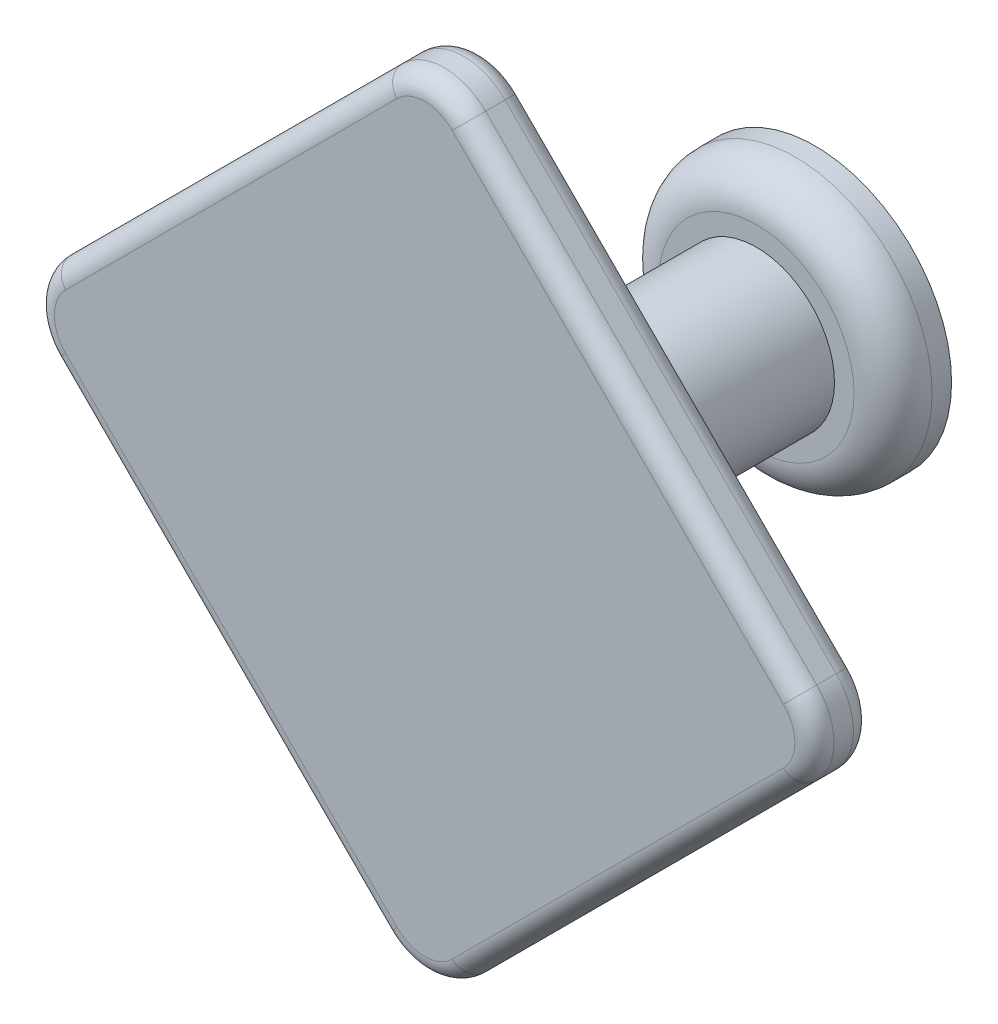
ISO-10303-21;
HEADER;
FILE_DESCRIPTION(('STEP AP214'),'2;1');
FILE_NAME('part.step','',(''),(''),'','','');
FILE_SCHEMA(('AUTOMOTIVE_DESIGN { 1 0 10303 214 1 1 1 1 }'));
ENDSEC;
DATA;
#1=APPLICATION_CONTEXT('core data for automotive mechanical design processes');
#2=APPLICATION_PROTOCOL_DEFINITION('international standard','automotive_design',2000,#1);
#3=PRODUCT_CONTEXT('',#1,'mechanical');
#4=PRODUCT('Part','Part','',(#3));
#5=PRODUCT_RELATED_PRODUCT_CATEGORY('part','',(#4));
#6=PRODUCT_DEFINITION_FORMATION('','',#4);
#7=PRODUCT_DEFINITION_CONTEXT('part definition',#1,'design');
#8=PRODUCT_DEFINITION('design','',#6,#7);
#9=PRODUCT_DEFINITION_SHAPE('','',#8);
#10=(LENGTH_UNIT() NAMED_UNIT(*) SI_UNIT(.MILLI.,.METRE.));
#11=(NAMED_UNIT(*) PLANE_ANGLE_UNIT() SI_UNIT($,.RADIAN.));
#12=(NAMED_UNIT(*) SI_UNIT($,.STERADIAN.) SOLID_ANGLE_UNIT());
#13=UNCERTAINTY_MEASURE_WITH_UNIT(LENGTH_MEASURE(1.E-05),#10,'distance_accuracy_value','');
#14=(GEOMETRIC_REPRESENTATION_CONTEXT(3) GLOBAL_UNCERTAINTY_ASSIGNED_CONTEXT((#13)) GLOBAL_UNIT_ASSIGNED_CONTEXT((#10,
#11,#12)) REPRESENTATION_CONTEXT('',''));
#15=CARTESIAN_POINT('',(0.,0.,0.));
#16=DIRECTION('',(0.,0.,1.));
#17=DIRECTION('',(1.,0.,0.));
#18=AXIS2_PLACEMENT_3D('',#15,#16,#17);
#19=CARTESIAN_POINT('',(10.6066017177982,-10.6066017177982,1.5));
#20=DIRECTION('',(-0.707106781186547,0.707106781186548,0.));
#21=DIRECTION('',(-0.707106781186548,-0.707106781186547,0.));
#22=AXIS2_PLACEMENT_3D('',#19,#20,#21);
#23=PLANE('',#22);
#24=DIRECTION('',(0.,0.,-1.));
#25=VECTOR('',#24,1.);
#26=CARTESIAN_POINT('',(2.12132034355964,-19.0918830920368,1.5));
#27=LINE('',#26,#25);
#28=CARTESIAN_POINT('',(2.12132034355964,-19.0918830920368,0.5));
#29=VERTEX_POINT('',#28);
#30=CARTESIAN_POINT('',(2.12132034355964,-19.0918830920368,-0.5));
#31=VERTEX_POINT('',#30);
#32=EDGE_CURVE('E448',#29,#31,#27,.T.);
#33=ORIENTED_EDGE('',*,*,#32,.T.);
#34=DIRECTION('',(0.707106781186548,0.707106781186547,0.));
#35=VECTOR('',#34,1.);
#36=CARTESIAN_POINT('',(10.6066017177982,-10.6066017177982,-0.5));
#37=LINE('',#36,#35);
#38=CARTESIAN_POINT('',(19.0918830920368,-2.12132034355965,-0.5));
#39=VERTEX_POINT('',#38);
#40=EDGE_CURVE('E237',#31,#39,#37,.T.);
#41=ORIENTED_EDGE('',*,*,#40,.T.);
#42=DIRECTION('',(0.,0.,-1.));
#43=VECTOR('',#42,1.);
#44=CARTESIAN_POINT('',(19.0918830920368,-2.12132034355965,1.5));
#45=LINE('',#44,#43);
#46=CARTESIAN_POINT('',(19.0918830920368,-2.12132034355965,0.5));
#47=VERTEX_POINT('',#46);
#48=EDGE_CURVE('E204',#39,#47,#45,.F.);
#49=ORIENTED_EDGE('',*,*,#48,.T.);
#50=DIRECTION('',(0.707106781186548,0.707106781186547,0.));
#51=VECTOR('',#50,1.);
#52=CARTESIAN_POINT('',(2.12132034355964,-19.0918830920368,0.5));
#53=LINE('',#52,#51);
#54=EDGE_CURVE('E235',#47,#29,#53,.F.);
#55=ORIENTED_EDGE('',*,*,#54,.T.);
#56=EDGE_LOOP('',(#33,#41,#49,#55));
#57=FACE_BOUND('',#56,.T.);
#58=ADVANCED_FACE('F68',(#57),#23,.F.);
#59=CARTESIAN_POINT('',(10.6066017177982,10.6066017177982,1.5));
#60=DIRECTION('',(0.707106781186548,0.707106781186547,0.));
#61=DIRECTION('',(-0.707106781186547,0.707106781186548,0.));
#62=AXIS2_PLACEMENT_3D('',#59,#60,#61);
#63=PLANE('',#62);
#64=DIRECTION('',(0.,0.,-1.));
#65=VECTOR('',#64,1.);
#66=CARTESIAN_POINT('',(19.0918830920368,2.12132034355964,-1.5));
#67=LINE('',#66,#65);
#68=CARTESIAN_POINT('',(19.0918830920368,2.12132034355964,0.5));
#69=VERTEX_POINT('',#68);
#70=CARTESIAN_POINT('',(19.0918830920368,2.12132034355964,-0.5));
#71=VERTEX_POINT('',#70);
#72=EDGE_CURVE('E445',#69,#71,#67,.T.);
#73=ORIENTED_EDGE('',*,*,#72,.T.);
#74=DIRECTION('',(0.707106781186547,-0.707106781186548,0.));
#75=VECTOR('',#74,1.);
#76=CARTESIAN_POINT('',(2.12132034355964,19.0918830920368,-0.5));
#77=LINE('',#76,#75);
#78=CARTESIAN_POINT('',(2.12132034355965,19.0918830920368,-0.5));
#79=VERTEX_POINT('',#78);
#80=EDGE_CURVE('E260',#71,#79,#77,.F.);
#81=ORIENTED_EDGE('',*,*,#80,.T.);
#82=DIRECTION('',(0.,0.,-1.));
#83=VECTOR('',#82,1.);
#84=CARTESIAN_POINT('',(2.12132034355965,19.0918830920368,1.5));
#85=LINE('',#84,#83);
#86=CARTESIAN_POINT('',(2.12132034355965,19.0918830920368,0.5));
#87=VERTEX_POINT('',#86);
#88=EDGE_CURVE('E442',#79,#87,#85,.F.);
#89=ORIENTED_EDGE('',*,*,#88,.T.);
#90=DIRECTION('',(0.707106781186547,-0.707106781186548,0.));
#91=VECTOR('',#90,1.);
#92=CARTESIAN_POINT('',(10.6066017177982,10.6066017177982,0.5));
#93=LINE('',#92,#91);
#94=EDGE_CURVE('E258',#87,#69,#93,.T.);
#95=ORIENTED_EDGE('',*,*,#94,.T.);
#96=EDGE_LOOP('',(#73,#81,#89,#95));
#97=FACE_BOUND('',#96,.T.);
#98=ADVANCED_FACE('F323',(#97),#63,.T.);
#99=CARTESIAN_POINT('',(-10.6066017177982,10.6066017177982,1.5));
#100=DIRECTION('',(-0.707106781186547,0.707106781186548,0.));
#101=DIRECTION('',(-0.707106781186548,-0.707106781186547,0.));
#102=AXIS2_PLACEMENT_3D('',#99,#100,#101);
#103=PLANE('',#102);
#104=DIRECTION('',(0.,0.,-1.));
#105=VECTOR('',#104,1.);
#106=CARTESIAN_POINT('',(-2.12132034355964,19.0918830920368,1.5));
#107=LINE('',#106,#105);
#108=CARTESIAN_POINT('',(-2.12132034355964,19.0918830920368,0.5));
#109=VERTEX_POINT('',#108);
#110=CARTESIAN_POINT('',(-2.12132034355964,19.0918830920368,-0.5));
#111=VERTEX_POINT('',#110);
#112=EDGE_CURVE('E433',#109,#111,#107,.T.);
#113=ORIENTED_EDGE('',*,*,#112,.T.);
#114=DIRECTION('',(0.707106781186548,0.707106781186547,0.));
#115=VECTOR('',#114,1.);
#116=CARTESIAN_POINT('',(-19.0918830920368,2.12132034355965,-0.5));
#117=LINE('',#116,#115);
#118=CARTESIAN_POINT('',(-19.0918830920368,2.12132034355965,-0.5));
#119=VERTEX_POINT('',#118);
#120=EDGE_CURVE('E221',#111,#119,#117,.F.);
#121=ORIENTED_EDGE('',*,*,#120,.T.);
#122=DIRECTION('',(0.,0.,-1.));
#123=VECTOR('',#122,1.);
#124=CARTESIAN_POINT('',(-19.0918830920368,2.12132034355965,1.5));
#125=LINE('',#124,#123);
#126=CARTESIAN_POINT('',(-19.0918830920368,2.12132034355965,0.5));
#127=VERTEX_POINT('',#126);
#128=EDGE_CURVE('E436',#119,#127,#125,.F.);
#129=ORIENTED_EDGE('',*,*,#128,.T.);
#130=DIRECTION('',(0.707106781186548,0.707106781186547,0.));
#131=VECTOR('',#130,1.);
#132=CARTESIAN_POINT('',(-10.6066017177982,10.6066017177982,0.5));
#133=LINE('',#132,#131);
#134=EDGE_CURVE('E219',#127,#109,#133,.T.);
#135=ORIENTED_EDGE('',*,*,#134,.T.);
#136=EDGE_LOOP('',(#113,#121,#129,#135));
#137=FACE_BOUND('',#136,.T.);
#138=ADVANCED_FACE('F329',(#137),#103,.T.);
#139=CARTESIAN_POINT('',(-10.6066017177982,-10.6066017177982,1.5));
#140=DIRECTION('',(0.707106781186547,0.707106781186547,0.));
#141=DIRECTION('',(-0.707106781186548,0.707106781186548,0.));
#142=AXIS2_PLACEMENT_3D('',#139,#140,#141);
#143=PLANE('',#142);
#144=DIRECTION('',(0.,0.,-1.));
#145=VECTOR('',#144,1.);
#146=CARTESIAN_POINT('',(-19.0918830920368,-2.12132034355963,-1.5));
#147=LINE('',#146,#145);
#148=CARTESIAN_POINT('',(-19.0918830920368,-2.12132034355963,0.5));
#149=VERTEX_POINT('',#148);
#150=CARTESIAN_POINT('',(-19.0918830920368,-2.12132034355963,-0.5));
#151=VERTEX_POINT('',#150);
#152=EDGE_CURVE('E427',#149,#151,#147,.T.);
#153=ORIENTED_EDGE('',*,*,#152,.T.);
#154=DIRECTION('',(0.707106781186548,-0.707106781186548,0.));
#155=VECTOR('',#154,1.);
#156=CARTESIAN_POINT('',(-10.6066017177982,-10.6066017177982,-0.5));
#157=LINE('',#156,#155);
#158=CARTESIAN_POINT('',(-2.12132034355965,-19.0918830920368,-0.5));
#159=VERTEX_POINT('',#158);
#160=EDGE_CURVE('E229',#151,#159,#157,.T.);
#161=ORIENTED_EDGE('',*,*,#160,.T.);
#162=DIRECTION('',(0.,0.,-1.));
#163=VECTOR('',#162,1.);
#164=CARTESIAN_POINT('',(-2.12132034355965,-19.0918830920368,1.5));
#165=LINE('',#164,#163);
#166=CARTESIAN_POINT('',(-2.12132034355965,-19.0918830920368,0.5));
#167=VERTEX_POINT('',#166);
#168=EDGE_CURVE('E280',#159,#167,#165,.F.);
#169=ORIENTED_EDGE('',*,*,#168,.T.);
#170=DIRECTION('',(0.707106781186548,-0.707106781186548,0.));
#171=VECTOR('',#170,1.);
#172=CARTESIAN_POINT('',(-19.0918830920368,-2.12132034355963,0.5));
#173=LINE('',#172,#171);
#174=EDGE_CURVE('E227',#167,#149,#173,.F.);
#175=ORIENTED_EDGE('',*,*,#174,.T.);
#176=EDGE_LOOP('',(#153,#161,#169,#175));
#177=FACE_BOUND('',#176,.T.);
#178=ADVANCED_FACE('F335',(#177),#143,.F.);
#179=CARTESIAN_POINT('',(0.,0.,-1.5));
#180=DIRECTION('',(0.,0.,1.));
#181=DIRECTION('',(1.,0.,0.));
#182=AXIS2_PLACEMENT_3D('',#179,#180,#181);
#183=PLANE('',#182);
#184=CARTESIAN_POINT('',(0.,0.,-1.5));
#185=DIRECTION('',(0.,0.,1.));
#186=DIRECTION('',(1.,0.,0.));
#187=AXIS2_PLACEMENT_3D('',#184,#185,#186);
#188=CIRCLE('',#187,4.);
#189=CARTESIAN_POINT('',(3.99999999999999,0.,-1.5));
#190=VERTEX_POINT('',#189);
#191=EDGE_CURVE('E283',#190,#190,#188,.T.);
#192=ORIENTED_EDGE('',*,*,#191,.T.);
#193=EDGE_LOOP('',(#192));
#194=FACE_BOUND('',#193,.T.);
#195=DIRECTION('',(0.707106781186548,0.707106781186547,0.));
#196=VECTOR('',#195,1.);
#197=CARTESIAN_POINT('',(-1.41421356237309,18.3847763108502,-1.5));
#198=LINE('',#197,#196);
#199=CARTESIAN_POINT('',(-18.3847763108502,1.4142135623731,-1.5));
#200=VERTEX_POINT('',#199);
#201=CARTESIAN_POINT('',(-1.41421356237309,18.3847763108502,-1.5));
#202=VERTEX_POINT('',#201);
#203=EDGE_CURVE('E208',#200,#202,#198,.T.);
#204=ORIENTED_EDGE('',*,*,#203,.T.);
#205=CARTESIAN_POINT('',(0.,16.9705627484771,-1.5));
#206=DIRECTION('',(0.,0.,1.));
#207=DIRECTION('',(1.,0.,0.));
#208=AXIS2_PLACEMENT_3D('',#205,#206,#207);
#209=CIRCLE('',#208,2.);
#210=CARTESIAN_POINT('',(1.4142135623731,18.3847763108502,-1.5));
#211=VERTEX_POINT('',#210);
#212=EDGE_CURVE('E188',#202,#211,#209,.F.);
#213=ORIENTED_EDGE('',*,*,#212,.T.);
#214=DIRECTION('',(0.707106781186547,-0.707106781186548,0.));
#215=VECTOR('',#214,1.);
#216=CARTESIAN_POINT('',(18.3847763108502,1.41421356237309,-1.5));
#217=LINE('',#216,#215);
#218=CARTESIAN_POINT('',(18.3847763108502,1.41421356237309,-1.5));
#219=VERTEX_POINT('',#218);
#220=EDGE_CURVE('E197',#211,#219,#217,.T.);
#221=ORIENTED_EDGE('',*,*,#220,.T.);
#222=CARTESIAN_POINT('',(16.9705627484771,0.,-1.5));
#223=DIRECTION('',(0.,0.,1.));
#224=DIRECTION('',(1.,0.,0.));
#225=AXIS2_PLACEMENT_3D('',#222,#223,#224);
#226=CIRCLE('',#225,2.);
#227=CARTESIAN_POINT('',(18.3847763108502,-1.4142135623731,-1.5));
#228=VERTEX_POINT('',#227);
#229=EDGE_CURVE('E203',#219,#228,#226,.F.);
#230=ORIENTED_EDGE('',*,*,#229,.T.);
#231=DIRECTION('',(0.707106781186548,0.707106781186547,0.));
#232=VECTOR('',#231,1.);
#233=CARTESIAN_POINT('',(9.89949493661166,-9.89949493661167,-1.5));
#234=LINE('',#233,#232);
#235=CARTESIAN_POINT('',(1.41421356237309,-18.3847763108502,-1.5));
#236=VERTEX_POINT('',#235);
#237=EDGE_CURVE('E453',#228,#236,#234,.F.);
#238=ORIENTED_EDGE('',*,*,#237,.T.);
#239=CARTESIAN_POINT('',(0.,-16.9705627484771,-1.5));
#240=DIRECTION('',(0.,0.,1.));
#241=DIRECTION('',(1.,0.,0.));
#242=AXIS2_PLACEMENT_3D('',#239,#240,#241);
#243=CIRCLE('',#242,2.);
#244=CARTESIAN_POINT('',(-1.4142135623731,-18.3847763108502,-1.5));
#245=VERTEX_POINT('',#244);
#246=EDGE_CURVE('E455',#236,#245,#243,.F.);
#247=ORIENTED_EDGE('',*,*,#246,.T.);
#248=DIRECTION('',(0.707106781186548,-0.707106781186548,0.));
#249=VECTOR('',#248,1.);
#250=CARTESIAN_POINT('',(-9.89949493661166,-9.89949493661166,-1.5));
#251=LINE('',#250,#249);
#252=CARTESIAN_POINT('',(-18.3847763108502,-1.41421356237309,-1.5));
#253=VERTEX_POINT('',#252);
#254=EDGE_CURVE('E457',#245,#253,#251,.F.);
#255=ORIENTED_EDGE('',*,*,#254,.T.);
#256=CARTESIAN_POINT('',(-16.9705627484771,0.,-1.5));
#257=DIRECTION('',(0.,0.,1.));
#258=DIRECTION('',(1.,0.,0.));
#259=AXIS2_PLACEMENT_3D('',#256,#257,#258);
#260=CIRCLE('',#259,2.);
#261=EDGE_CURVE('E214',#253,#200,#260,.F.);
#262=ORIENTED_EDGE('',*,*,#261,.T.);
#263=EDGE_LOOP('',(#204,#213,#221,#230,#238,#247,#255,#262));
#264=FACE_BOUND('',#263,.T.);
#265=ADVANCED_FACE('F206',(#194,#264),#183,.F.);
#266=CARTESIAN_POINT('',(0.,0.,1.5));
#267=DIRECTION('',(0.,0.,1.));
#268=DIRECTION('',(1.,0.,0.));
#269=AXIS2_PLACEMENT_3D('',#266,#267,#268);
#270=PLANE('',#269);
#271=DIRECTION('',(0.707106781186547,-0.707106781186548,0.));
#272=VECTOR('',#271,1.);
#273=CARTESIAN_POINT('',(9.89949493661167,9.89949493661167,1.5));
#274=LINE('',#273,#272);
#275=CARTESIAN_POINT('',(18.3847763108502,1.41421356237309,1.5));
#276=VERTEX_POINT('',#275);
#277=CARTESIAN_POINT('',(1.4142135623731,18.3847763108502,1.5));
#278=VERTEX_POINT('',#277);
#279=EDGE_CURVE('E243',#276,#278,#274,.F.);
#280=ORIENTED_EDGE('',*,*,#279,.T.);
#281=CARTESIAN_POINT('',(0.,16.9705627484771,1.5));
#282=DIRECTION('',(0.,0.,1.));
#283=DIRECTION('',(1.,0.,0.));
#284=AXIS2_PLACEMENT_3D('',#281,#282,#283);
#285=CIRCLE('',#284,2.);
#286=CARTESIAN_POINT('',(-1.41421356237309,18.3847763108502,1.5));
#287=VERTEX_POINT('',#286);
#288=EDGE_CURVE('E256',#278,#287,#285,.T.);
#289=ORIENTED_EDGE('',*,*,#288,.T.);
#290=DIRECTION('',(0.707106781186548,0.707106781186547,0.));
#291=VECTOR('',#290,1.);
#292=CARTESIAN_POINT('',(-9.89949493661167,9.89949493661167,1.5));
#293=LINE('',#292,#291);
#294=CARTESIAN_POINT('',(-18.3847763108502,1.4142135623731,1.5));
#295=VERTEX_POINT('',#294);
#296=EDGE_CURVE('E90',#287,#295,#293,.F.);
#297=ORIENTED_EDGE('',*,*,#296,.T.);
#298=CARTESIAN_POINT('',(-16.9705627484771,0.,1.5));
#299=DIRECTION('',(0.,0.,1.));
#300=DIRECTION('',(1.,0.,0.));
#301=AXIS2_PLACEMENT_3D('',#298,#299,#300);
#302=CIRCLE('',#301,2.);
#303=CARTESIAN_POINT('',(-18.3847763108502,-1.41421356237309,1.5));
#304=VERTEX_POINT('',#303);
#305=EDGE_CURVE('E253',#295,#304,#302,.T.);
#306=ORIENTED_EDGE('',*,*,#305,.T.);
#307=DIRECTION('',(0.707106781186548,-0.707106781186548,0.));
#308=VECTOR('',#307,1.);
#309=CARTESIAN_POINT('',(-1.4142135623731,-18.3847763108502,1.5));
#310=LINE('',#309,#308);
#311=CARTESIAN_POINT('',(-1.4142135623731,-18.3847763108502,1.5));
#312=VERTEX_POINT('',#311);
#313=EDGE_CURVE('E251',#304,#312,#310,.T.);
#314=ORIENTED_EDGE('',*,*,#313,.T.);
#315=CARTESIAN_POINT('',(0.,-16.9705627484771,1.5));
#316=DIRECTION('',(0.,0.,1.));
#317=DIRECTION('',(1.,0.,0.));
#318=AXIS2_PLACEMENT_3D('',#315,#316,#317);
#319=CIRCLE('',#318,2.);
#320=CARTESIAN_POINT('',(1.41421356237309,-18.3847763108502,1.5));
#321=VERTEX_POINT('',#320);
#322=EDGE_CURVE('E249',#312,#321,#319,.T.);
#323=ORIENTED_EDGE('',*,*,#322,.T.);
#324=DIRECTION('',(0.707106781186548,0.707106781186547,0.));
#325=VECTOR('',#324,1.);
#326=CARTESIAN_POINT('',(18.3847763108502,-1.4142135623731,1.5));
#327=LINE('',#326,#325);
#328=CARTESIAN_POINT('',(18.3847763108502,-1.4142135623731,1.5));
#329=VERTEX_POINT('',#328);
#330=EDGE_CURVE('E247',#321,#329,#327,.T.);
#331=ORIENTED_EDGE('',*,*,#330,.T.);
#332=CARTESIAN_POINT('',(16.9705627484771,0.,1.5));
#333=DIRECTION('',(0.,0.,1.));
#334=DIRECTION('',(1.,0.,0.));
#335=AXIS2_PLACEMENT_3D('',#332,#333,#334);
#336=CIRCLE('',#335,2.);
#337=EDGE_CURVE('E245',#329,#276,#336,.T.);
#338=ORIENTED_EDGE('',*,*,#337,.T.);
#339=EDGE_LOOP('',(#280,#289,#297,#306,#314,#323,#331,#338));
#340=FACE_BOUND('',#339,.T.);
#341=ADVANCED_FACE('F343',(#340),#270,.T.);
#342=CARTESIAN_POINT('',(-16.9705627484771,0.,1.5));
#343=DIRECTION('',(0.,0.,1.));
#344=DIRECTION('',(1.,0.,0.));
#345=AXIS2_PLACEMENT_3D('',#342,#343,#344);
#346=CYLINDRICAL_SURFACE('',#345,3.);
#347=ORIENTED_EDGE('',*,*,#128,.F.);
#348=CARTESIAN_POINT('',(-16.9705627484771,0.,-0.5));
#349=DIRECTION('',(0.,0.,1.));
#350=DIRECTION('',(1.,0.,0.));
#351=AXIS2_PLACEMENT_3D('',#348,#349,#350);
#352=CIRCLE('',#351,3.);
#353=EDGE_CURVE('E225',#119,#151,#352,.T.);
#354=ORIENTED_EDGE('',*,*,#353,.T.);
#355=ORIENTED_EDGE('',*,*,#152,.F.);
#356=CARTESIAN_POINT('',(-16.9705627484771,0.,0.5));
#357=DIRECTION('',(0.,0.,1.));
#358=DIRECTION('',(1.,0.,0.));
#359=AXIS2_PLACEMENT_3D('',#356,#357,#358);
#360=CIRCLE('',#359,3.);
#361=EDGE_CURVE('E223',#149,#127,#360,.F.);
#362=ORIENTED_EDGE('',*,*,#361,.T.);
#363=EDGE_LOOP('',(#347,#354,#355,#362));
#364=FACE_BOUND('',#363,.T.);
#365=ADVANCED_FACE('F339',(#364),#346,.T.);
#366=CARTESIAN_POINT('',(16.9705627484771,0.,1.5));
#367=DIRECTION('',(0.,0.,1.));
#368=DIRECTION('',(1.,0.,0.));
#369=AXIS2_PLACEMENT_3D('',#366,#367,#368);
#370=CYLINDRICAL_SURFACE('',#369,3.);
#371=ORIENTED_EDGE('',*,*,#48,.F.);
#372=CARTESIAN_POINT('',(16.9705627484771,0.,-0.5));
#373=DIRECTION('',(0.,0.,1.));
#374=DIRECTION('',(1.,0.,0.));
#375=AXIS2_PLACEMENT_3D('',#372,#373,#374);
#376=CIRCLE('',#375,3.);
#377=EDGE_CURVE('E241',#39,#71,#376,.T.);
#378=ORIENTED_EDGE('',*,*,#377,.T.);
#379=ORIENTED_EDGE('',*,*,#72,.F.);
#380=CARTESIAN_POINT('',(16.9705627484771,0.,0.5));
#381=DIRECTION('',(0.,0.,1.));
#382=DIRECTION('',(1.,0.,0.));
#383=AXIS2_PLACEMENT_3D('',#380,#381,#382);
#384=CIRCLE('',#383,3.);
#385=EDGE_CURVE('E239',#69,#47,#384,.F.);
#386=ORIENTED_EDGE('',*,*,#385,.T.);
#387=EDGE_LOOP('',(#371,#378,#379,#386));
#388=FACE_BOUND('',#387,.T.);
#389=ADVANCED_FACE('F342',(#388),#370,.T.);
#390=CARTESIAN_POINT('',(0.,-16.9705627484771,1.5));
#391=DIRECTION('',(0.,0.,-1.));
#392=DIRECTION('',(-1.,0.,0.));
#393=AXIS2_PLACEMENT_3D('',#390,#391,#392);
#394=CYLINDRICAL_SURFACE('',#393,3.);
#395=ORIENTED_EDGE('',*,*,#168,.F.);
#396=CARTESIAN_POINT('',(0.,-16.9705627484771,-0.5));
#397=DIRECTION('',(0.,0.,1.));
#398=DIRECTION('',(1.,0.,0.));
#399=AXIS2_PLACEMENT_3D('',#396,#397,#398);
#400=CIRCLE('',#399,3.);
#401=EDGE_CURVE('E233',#159,#31,#400,.T.);
#402=ORIENTED_EDGE('',*,*,#401,.T.);
#403=ORIENTED_EDGE('',*,*,#32,.F.);
#404=CARTESIAN_POINT('',(0.,-16.9705627484771,0.5));
#405=DIRECTION('',(0.,0.,1.));
#406=DIRECTION('',(1.,0.,0.));
#407=AXIS2_PLACEMENT_3D('',#404,#405,#406);
#408=CIRCLE('',#407,3.);
#409=EDGE_CURVE('E231',#29,#167,#408,.F.);
#410=ORIENTED_EDGE('',*,*,#409,.T.);
#411=EDGE_LOOP('',(#395,#402,#403,#410));
#412=FACE_BOUND('',#411,.T.);
#413=ADVANCED_FACE('F347',(#412),#394,.T.);
#414=CARTESIAN_POINT('',(0.,16.9705627484771,1.5));
#415=DIRECTION('',(0.,0.,-1.));
#416=DIRECTION('',(-1.,0.,0.));
#417=AXIS2_PLACEMENT_3D('',#414,#415,#416);
#418=CYLINDRICAL_SURFACE('',#417,3.);
#419=ORIENTED_EDGE('',*,*,#88,.F.);
#420=CARTESIAN_POINT('',(0.,16.9705627484771,-0.5));
#421=DIRECTION('',(0.,0.,1.));
#422=DIRECTION('',(1.,0.,0.));
#423=AXIS2_PLACEMENT_3D('',#420,#421,#422);
#424=CIRCLE('',#423,3.);
#425=EDGE_CURVE('E190',#79,#111,#424,.T.);
#426=ORIENTED_EDGE('',*,*,#425,.T.);
#427=ORIENTED_EDGE('',*,*,#112,.F.);
#428=CARTESIAN_POINT('',(0.,16.9705627484771,0.5));
#429=DIRECTION('',(0.,0.,1.));
#430=DIRECTION('',(1.,0.,0.));
#431=AXIS2_PLACEMENT_3D('',#428,#429,#430);
#432=CIRCLE('',#431,3.);
#433=EDGE_CURVE('E210',#109,#87,#432,.F.);
#434=ORIENTED_EDGE('',*,*,#433,.T.);
#435=EDGE_LOOP('',(#419,#426,#427,#434));
#436=FACE_BOUND('',#435,.T.);
#437=ADVANCED_FACE('F351',(#436),#418,.T.);
#438=CARTESIAN_POINT('',(0.,-16.9705627484771,-0.5));
#439=DIRECTION('',(0.,0.,1.));
#440=DIRECTION('',(1.,0.,0.));
#441=AXIS2_PLACEMENT_3D('',#438,#439,#440);
#442=TOROIDAL_SURFACE('',#441,2.,1.);
#443=CARTESIAN_POINT('',(1.41421356237309,-18.3847763108502,-0.5));
#444=DIRECTION('',(0.707106781186548,0.707106781186547,0.));
#445=DIRECTION('',(-0.707106781186547,0.707106781186548,0.));
#446=AXIS2_PLACEMENT_3D('',#443,#444,#445);
#447=CIRCLE('',#446,1.);
#448=EDGE_CURVE('E274',#31,#236,#447,.T.);
#449=ORIENTED_EDGE('',*,*,#448,.F.);
#450=ORIENTED_EDGE('',*,*,#401,.F.);
#451=CARTESIAN_POINT('',(-1.4142135623731,-18.3847763108502,-0.5));
#452=DIRECTION('',(-0.707106781186549,0.707106781186546,0.));
#453=DIRECTION('',(-0.707106781186546,-0.707106781186549,0.));
#454=AXIS2_PLACEMENT_3D('',#451,#452,#453);
#455=CIRCLE('',#454,1.);
#456=EDGE_CURVE('E277',#245,#159,#455,.T.);
#457=ORIENTED_EDGE('',*,*,#456,.F.);
#458=ORIENTED_EDGE('',*,*,#246,.F.);
#459=EDGE_LOOP('',(#449,#450,#457,#458));
#460=FACE_BOUND('',#459,.T.);
#461=ADVANCED_FACE('F355',(#460),#442,.T.);
#462=CARTESIAN_POINT('',(-9.89949493661166,-9.89949493661166,-0.5));
#463=DIRECTION('',(0.707106781186548,-0.707106781186548,0.));
#464=DIRECTION('',(0.707106781186548,0.707106781186548,0.));
#465=AXIS2_PLACEMENT_3D('',#462,#463,#464);
#466=CYLINDRICAL_SURFACE('',#465,1.);
#467=ORIENTED_EDGE('',*,*,#456,.T.);
#468=ORIENTED_EDGE('',*,*,#160,.F.);
#469=CARTESIAN_POINT('',(-18.3847763108502,-1.41421356237309,-0.5));
#470=DIRECTION('',(-0.707106781186546,0.707106781186549,0.));
#471=DIRECTION('',(-0.707106781186549,-0.707106781186546,0.));
#472=AXIS2_PLACEMENT_3D('',#469,#470,#471);
#473=CIRCLE('',#472,1.);
#474=EDGE_CURVE('E271',#253,#151,#473,.T.);
#475=ORIENTED_EDGE('',*,*,#474,.F.);
#476=ORIENTED_EDGE('',*,*,#254,.F.);
#477=EDGE_LOOP('',(#467,#468,#475,#476));
#478=FACE_BOUND('',#477,.T.);
#479=ADVANCED_FACE('F377',(#478),#466,.T.);
#480=CARTESIAN_POINT('',(9.89949493661166,-9.89949493661167,-0.5));
#481=DIRECTION('',(0.707106781186548,0.707106781186547,0.));
#482=DIRECTION('',(-0.707106781186547,0.707106781186548,0.));
#483=AXIS2_PLACEMENT_3D('',#480,#481,#482);
#484=CYLINDRICAL_SURFACE('',#483,1.);
#485=ORIENTED_EDGE('',*,*,#448,.T.);
#486=ORIENTED_EDGE('',*,*,#237,.F.);
#487=CARTESIAN_POINT('',(18.3847763108502,-1.4142135623731,-0.5));
#488=DIRECTION('',(0.707106781186547,0.707106781186548,0.));
#489=DIRECTION('',(-0.707106781186548,0.707106781186547,0.));
#490=AXIS2_PLACEMENT_3D('',#487,#488,#489);
#491=CIRCLE('',#490,1.);
#492=EDGE_CURVE('E268',#39,#228,#491,.T.);
#493=ORIENTED_EDGE('',*,*,#492,.F.);
#494=ORIENTED_EDGE('',*,*,#40,.F.);
#495=EDGE_LOOP('',(#485,#486,#493,#494));
#496=FACE_BOUND('',#495,.T.);
#497=ADVANCED_FACE('F373',(#496),#484,.T.);
#498=CARTESIAN_POINT('',(-16.9705627484771,0.,-0.5));
#499=DIRECTION('',(0.,0.,1.));
#500=DIRECTION('',(1.,0.,0.));
#501=AXIS2_PLACEMENT_3D('',#498,#499,#500);
#502=TOROIDAL_SURFACE('',#501,2.,1.);
#503=ORIENTED_EDGE('',*,*,#474,.T.);
#504=ORIENTED_EDGE('',*,*,#353,.F.);
#505=CARTESIAN_POINT('',(-18.3847763108502,1.4142135623731,-0.5));
#506=DIRECTION('',(0.707106781186547,0.707106781186548,0.));
#507=DIRECTION('',(-0.707106781186548,0.707106781186547,0.));
#508=AXIS2_PLACEMENT_3D('',#505,#506,#507);
#509=CIRCLE('',#508,1.);
#510=EDGE_CURVE('E265',#200,#119,#509,.T.);
#511=ORIENTED_EDGE('',*,*,#510,.F.);
#512=ORIENTED_EDGE('',*,*,#261,.F.);
#513=EDGE_LOOP('',(#503,#504,#511,#512));
#514=FACE_BOUND('',#513,.T.);
#515=ADVANCED_FACE('F369',(#514),#502,.T.);
#516=CARTESIAN_POINT('',(16.9705627484771,0.,-0.5));
#517=DIRECTION('',(0.,0.,1.));
#518=DIRECTION('',(1.,0.,0.));
#519=AXIS2_PLACEMENT_3D('',#516,#517,#518);
#520=TOROIDAL_SURFACE('',#519,2.,1.);
#521=ORIENTED_EDGE('',*,*,#492,.T.);
#522=ORIENTED_EDGE('',*,*,#229,.F.);
#523=CARTESIAN_POINT('',(18.3847763108502,1.41421356237309,-0.5));
#524=DIRECTION('',(-0.707106781186547,0.707106781186548,0.));
#525=DIRECTION('',(-0.707106781186548,-0.707106781186547,0.));
#526=AXIS2_PLACEMENT_3D('',#523,#524,#525);
#527=CIRCLE('',#526,1.);
#528=EDGE_CURVE('E200',#71,#219,#527,.T.);
#529=ORIENTED_EDGE('',*,*,#528,.F.);
#530=ORIENTED_EDGE('',*,*,#377,.F.);
#531=EDGE_LOOP('',(#521,#522,#529,#530));
#532=FACE_BOUND('',#531,.T.);
#533=ADVANCED_FACE('F365',(#532),#520,.T.);
#534=CARTESIAN_POINT('',(-9.89949493661167,9.89949493661167,-0.5));
#535=DIRECTION('',(-0.707106781186548,-0.707106781186547,0.));
#536=DIRECTION('',(0.707106781186547,-0.707106781186548,0.));
#537=AXIS2_PLACEMENT_3D('',#534,#535,#536);
#538=CYLINDRICAL_SURFACE('',#537,1.);
#539=ORIENTED_EDGE('',*,*,#510,.T.);
#540=ORIENTED_EDGE('',*,*,#120,.F.);
#541=CARTESIAN_POINT('',(-1.41421356237309,18.3847763108502,-0.5));
#542=DIRECTION('',(0.707106781186549,0.707106781186546,0.));
#543=DIRECTION('',(-0.707106781186546,0.707106781186549,0.));
#544=AXIS2_PLACEMENT_3D('',#541,#542,#543);
#545=CIRCLE('',#544,1.);
#546=EDGE_CURVE('E193',#202,#111,#545,.T.);
#547=ORIENTED_EDGE('',*,*,#546,.F.);
#548=ORIENTED_EDGE('',*,*,#203,.F.);
#549=EDGE_LOOP('',(#539,#540,#547,#548));
#550=FACE_BOUND('',#549,.T.);
#551=ADVANCED_FACE('F362',(#550),#538,.T.);
#552=CARTESIAN_POINT('',(9.89949493661167,9.89949493661166,-0.5));
#553=DIRECTION('',(-0.707106781186547,0.707106781186548,0.));
#554=DIRECTION('',(-0.707106781186548,-0.707106781186547,0.));
#555=AXIS2_PLACEMENT_3D('',#552,#553,#554);
#556=CYLINDRICAL_SURFACE('',#555,1.);
#557=ORIENTED_EDGE('',*,*,#528,.T.);
#558=ORIENTED_EDGE('',*,*,#220,.F.);
#559=CARTESIAN_POINT('',(1.4142135623731,18.3847763108502,-0.5));
#560=DIRECTION('',(-0.707106781186548,0.707106781186547,0.));
#561=DIRECTION('',(-0.707106781186547,-0.707106781186548,0.));
#562=AXIS2_PLACEMENT_3D('',#559,#560,#561);
#563=CIRCLE('',#562,1.);
#564=EDGE_CURVE('E184',#79,#211,#563,.T.);
#565=ORIENTED_EDGE('',*,*,#564,.F.);
#566=ORIENTED_EDGE('',*,*,#80,.F.);
#567=EDGE_LOOP('',(#557,#558,#565,#566));
#568=FACE_BOUND('',#567,.T.);
#569=ADVANCED_FACE('F198',(#568),#556,.T.);
#570=CARTESIAN_POINT('',(0.,16.9705627484771,-0.5));
#571=DIRECTION('',(0.,0.,1.));
#572=DIRECTION('',(1.,0.,0.));
#573=AXIS2_PLACEMENT_3D('',#570,#571,#572);
#574=TOROIDAL_SURFACE('',#573,2.,1.);
#575=ORIENTED_EDGE('',*,*,#546,.T.);
#576=ORIENTED_EDGE('',*,*,#425,.F.);
#577=ORIENTED_EDGE('',*,*,#564,.T.);
#578=ORIENTED_EDGE('',*,*,#212,.F.);
#579=EDGE_LOOP('',(#575,#576,#577,#578));
#580=FACE_BOUND('',#579,.T.);
#581=ADVANCED_FACE('F186',(#580),#574,.T.);
#582=CARTESIAN_POINT('',(0.,-16.9705627484771,0.5));
#583=DIRECTION('',(0.,0.,1.));
#584=DIRECTION('',(1.,0.,0.));
#585=AXIS2_PLACEMENT_3D('',#582,#583,#584);
#586=TOROIDAL_SURFACE('',#585,2.,1.);
#587=CARTESIAN_POINT('',(-1.4142135623731,-18.3847763108502,0.5));
#588=DIRECTION('',(-0.707106781186548,0.707106781186547,0.));
#589=DIRECTION('',(-0.707106781186547,-0.707106781186548,0.));
#590=AXIS2_PLACEMENT_3D('',#587,#588,#589);
#591=CIRCLE('',#590,1.);
#592=EDGE_CURVE('E297',#167,#312,#591,.T.);
#593=ORIENTED_EDGE('',*,*,#592,.F.);
#594=ORIENTED_EDGE('',*,*,#409,.F.);
#595=CARTESIAN_POINT('',(1.41421356237309,-18.3847763108502,0.5));
#596=DIRECTION('',(0.707106781186548,0.707106781186547,0.));
#597=DIRECTION('',(-0.707106781186547,0.707106781186548,0.));
#598=AXIS2_PLACEMENT_3D('',#595,#596,#597);
#599=CIRCLE('',#598,1.);
#600=EDGE_CURVE('E194',#321,#29,#599,.T.);
#601=ORIENTED_EDGE('',*,*,#600,.F.);
#602=ORIENTED_EDGE('',*,*,#322,.F.);
#603=EDGE_LOOP('',(#593,#594,#601,#602));
#604=FACE_BOUND('',#603,.T.);
#605=ADVANCED_FACE('F359',(#604),#586,.T.);
#606=CARTESIAN_POINT('',(9.89949493661166,-9.89949493661167,0.5));
#607=DIRECTION('',(-0.707106781186548,-0.707106781186547,0.));
#608=DIRECTION('',(0.707106781186547,-0.707106781186548,0.));
#609=AXIS2_PLACEMENT_3D('',#606,#607,#608);
#610=CYLINDRICAL_SURFACE('',#609,1.);
#611=ORIENTED_EDGE('',*,*,#600,.T.);
#612=ORIENTED_EDGE('',*,*,#54,.F.);
#613=CARTESIAN_POINT('',(18.3847763108502,-1.4142135623731,0.5));
#614=DIRECTION('',(0.707106781186548,0.707106781186548,0.));
#615=DIRECTION('',(-0.707106781186547,0.707106781186548,0.));
#616=AXIS2_PLACEMENT_3D('',#613,#614,#615);
#617=CIRCLE('',#616,1.);
#618=EDGE_CURVE('E294',#329,#47,#617,.T.);
#619=ORIENTED_EDGE('',*,*,#618,.F.);
#620=ORIENTED_EDGE('',*,*,#330,.F.);
#621=EDGE_LOOP('',(#611,#612,#619,#620));
#622=FACE_BOUND('',#621,.T.);
#623=ADVANCED_FACE('F408',(#622),#610,.T.);
#624=CARTESIAN_POINT('',(-9.89949493661166,-9.89949493661166,0.5));
#625=DIRECTION('',(-0.707106781186548,0.707106781186548,0.));
#626=DIRECTION('',(-0.707106781186548,-0.707106781186548,0.));
#627=AXIS2_PLACEMENT_3D('',#624,#625,#626);
#628=CYLINDRICAL_SURFACE('',#627,1.);
#629=ORIENTED_EDGE('',*,*,#592,.T.);
#630=ORIENTED_EDGE('',*,*,#313,.F.);
#631=CARTESIAN_POINT('',(-18.3847763108502,-1.41421356237309,0.5));
#632=DIRECTION('',(-0.707106781186547,0.707106781186548,0.));
#633=DIRECTION('',(-0.707106781186548,-0.707106781186547,0.));
#634=AXIS2_PLACEMENT_3D('',#631,#632,#633);
#635=CIRCLE('',#634,1.);
#636=EDGE_CURVE('E291',#149,#304,#635,.T.);
#637=ORIENTED_EDGE('',*,*,#636,.F.);
#638=ORIENTED_EDGE('',*,*,#174,.F.);
#639=EDGE_LOOP('',(#629,#630,#637,#638));
#640=FACE_BOUND('',#639,.T.);
#641=ADVANCED_FACE('F404',(#640),#628,.T.);
#642=CARTESIAN_POINT('',(16.9705627484771,0.,0.5));
#643=DIRECTION('',(0.,0.,1.));
#644=DIRECTION('',(1.,0.,0.));
#645=AXIS2_PLACEMENT_3D('',#642,#643,#644);
#646=TOROIDAL_SURFACE('',#645,2.,1.);
#647=ORIENTED_EDGE('',*,*,#618,.T.);
#648=ORIENTED_EDGE('',*,*,#385,.F.);
#649=CARTESIAN_POINT('',(18.3847763108502,1.41421356237309,0.5));
#650=DIRECTION('',(-0.707106781186547,0.707106781186548,0.));
#651=DIRECTION('',(-0.707106781186548,-0.707106781186547,0.));
#652=AXIS2_PLACEMENT_3D('',#649,#650,#651);
#653=CIRCLE('',#652,1.);
#654=EDGE_CURVE('E288',#276,#69,#653,.T.);
#655=ORIENTED_EDGE('',*,*,#654,.F.);
#656=ORIENTED_EDGE('',*,*,#337,.F.);
#657=EDGE_LOOP('',(#647,#648,#655,#656));
#658=FACE_BOUND('',#657,.T.);
#659=ADVANCED_FACE('F400',(#658),#646,.T.);
#660=CARTESIAN_POINT('',(-16.9705627484771,0.,0.5));
#661=DIRECTION('',(0.,0.,1.));
#662=DIRECTION('',(1.,0.,0.));
#663=AXIS2_PLACEMENT_3D('',#660,#661,#662);
#664=TOROIDAL_SURFACE('',#663,2.,1.);
#665=ORIENTED_EDGE('',*,*,#636,.T.);
#666=ORIENTED_EDGE('',*,*,#305,.F.);
#667=CARTESIAN_POINT('',(-18.3847763108502,1.4142135623731,0.5));
#668=DIRECTION('',(0.707106781186547,0.707106781186548,0.));
#669=DIRECTION('',(-0.707106781186548,0.707106781186547,0.));
#670=AXIS2_PLACEMENT_3D('',#667,#668,#669);
#671=CIRCLE('',#670,1.);
#672=EDGE_CURVE('E285',#127,#295,#671,.T.);
#673=ORIENTED_EDGE('',*,*,#672,.F.);
#674=ORIENTED_EDGE('',*,*,#361,.F.);
#675=EDGE_LOOP('',(#665,#666,#673,#674));
#676=FACE_BOUND('',#675,.T.);
#677=ADVANCED_FACE('F396',(#676),#664,.T.);
#678=CARTESIAN_POINT('',(9.89949493661167,9.89949493661167,0.5));
#679=DIRECTION('',(0.707106781186547,-0.707106781186548,0.));
#680=DIRECTION('',(0.707106781186548,0.707106781186547,0.));
#681=AXIS2_PLACEMENT_3D('',#678,#679,#680);
#682=CYLINDRICAL_SURFACE('',#681,1.);
#683=ORIENTED_EDGE('',*,*,#654,.T.);
#684=ORIENTED_EDGE('',*,*,#94,.F.);
#685=CARTESIAN_POINT('',(1.4142135623731,18.3847763108502,0.5));
#686=DIRECTION('',(-0.707106781186549,0.707106781186546,0.));
#687=DIRECTION('',(-0.707106781186546,-0.707106781186549,0.));
#688=AXIS2_PLACEMENT_3D('',#685,#686,#687);
#689=CIRCLE('',#688,1.);
#690=EDGE_CURVE('E282',#278,#87,#689,.T.);
#691=ORIENTED_EDGE('',*,*,#690,.F.);
#692=ORIENTED_EDGE('',*,*,#279,.F.);
#693=EDGE_LOOP('',(#683,#684,#691,#692));
#694=FACE_BOUND('',#693,.T.);
#695=ADVANCED_FACE('F392',(#694),#682,.T.);
#696=CARTESIAN_POINT('',(-9.89949493661167,9.89949493661167,0.5));
#697=DIRECTION('',(0.707106781186548,0.707106781186547,0.));
#698=DIRECTION('',(-0.707106781186547,0.707106781186548,0.));
#699=AXIS2_PLACEMENT_3D('',#696,#697,#698);
#700=CYLINDRICAL_SURFACE('',#699,1.);
#701=ORIENTED_EDGE('',*,*,#672,.T.);
#702=ORIENTED_EDGE('',*,*,#296,.F.);
#703=CARTESIAN_POINT('',(-1.41421356237309,18.3847763108502,0.5));
#704=DIRECTION('',(0.707106781186548,0.707106781186547,0.));
#705=DIRECTION('',(-0.707106781186547,0.707106781186548,0.));
#706=AXIS2_PLACEMENT_3D('',#703,#704,#705);
#707=CIRCLE('',#706,1.);
#708=EDGE_CURVE('E83',#109,#287,#707,.T.);
#709=ORIENTED_EDGE('',*,*,#708,.F.);
#710=ORIENTED_EDGE('',*,*,#134,.F.);
#711=EDGE_LOOP('',(#701,#702,#709,#710));
#712=FACE_BOUND('',#711,.T.);
#713=ADVANCED_FACE('F389',(#712),#700,.T.);
#714=CARTESIAN_POINT('',(0.,16.9705627484771,0.5));
#715=DIRECTION('',(0.,0.,1.));
#716=DIRECTION('',(1.,0.,0.));
#717=AXIS2_PLACEMENT_3D('',#714,#715,#716);
#718=TOROIDAL_SURFACE('',#717,2.,1.);
#719=ORIENTED_EDGE('',*,*,#690,.T.);
#720=ORIENTED_EDGE('',*,*,#433,.F.);
#721=ORIENTED_EDGE('',*,*,#708,.T.);
#722=ORIENTED_EDGE('',*,*,#288,.F.);
#723=EDGE_LOOP('',(#719,#720,#721,#722));
#724=FACE_BOUND('',#723,.T.);
#725=ADVANCED_FACE('F385',(#724),#718,.T.);
#726=CARTESIAN_POINT('',(0.,0.,-18.5));
#727=DIRECTION('',(0.,0.,1.));
#728=DIRECTION('',(1.,0.,0.));
#729=AXIS2_PLACEMENT_3D('',#726,#727,#728);
#730=CYLINDRICAL_SURFACE('',#729,4.);
#731=CARTESIAN_POINT('',(0.,0.,-15.5));
#732=DIRECTION('',(0.,0.,1.));
#733=DIRECTION('',(1.,0.,0.));
#734=AXIS2_PLACEMENT_3D('',#731,#732,#733);
#735=CIRCLE('',#734,4.);
#736=CARTESIAN_POINT('',(3.99999999999999,0.,-15.5));
#737=VERTEX_POINT('',#736);
#738=EDGE_CURVE('E304',#737,#737,#735,.F.);
#739=ORIENTED_EDGE('',*,*,#738,.F.);
#740=EDGE_LOOP('',(#739));
#741=FACE_BOUND('',#740,.T.);
#742=ORIENTED_EDGE('',*,*,#191,.F.);
#743=EDGE_LOOP('',(#742));
#744=FACE_BOUND('',#743,.T.);
#745=ADVANCED_FACE('F388',(#741,#744),#730,.T.);
#746=CARTESIAN_POINT('',(0.,0.,-15.5));
#747=DIRECTION('',(0.,0.,1.));
#748=DIRECTION('',(1.,0.,0.));
#749=AXIS2_PLACEMENT_3D('',#746,#747,#748);
#750=PLANE('',#749);
#751=CARTESIAN_POINT('',(0.,0.,-15.5));
#752=DIRECTION('',(0.,0.,1.));
#753=DIRECTION('',(1.,0.,0.));
#754=AXIS2_PLACEMENT_3D('',#751,#752,#753);
#755=CIRCLE('',#754,5.);
#756=CARTESIAN_POINT('',(5.00000000000001,0.,-15.5));
#757=VERTEX_POINT('',#756);
#758=EDGE_CURVE('E76',#757,#757,#755,.T.);
#759=ORIENTED_EDGE('',*,*,#758,.T.);
#760=EDGE_LOOP('',(#759));
#761=FACE_BOUND('',#760,.T.);
#762=ORIENTED_EDGE('',*,*,#738,.T.);
#763=EDGE_LOOP('',(#762));
#764=FACE_BOUND('',#763,.T.);
#765=ADVANCED_FACE('F309',(#761,#764),#750,.T.);
#766=CARTESIAN_POINT('',(0.,0.,-15.5));
#767=DIRECTION('',(0.,0.,-1.));
#768=DIRECTION('',(-1.,0.,0.));
#769=AXIS2_PLACEMENT_3D('',#766,#767,#768);
#770=CYLINDRICAL_SURFACE('',#769,7.);
#771=CARTESIAN_POINT('',(0.,0.,-17.5));
#772=DIRECTION('',(0.,0.,1.));
#773=DIRECTION('',(1.,0.,0.));
#774=AXIS2_PLACEMENT_3D('',#771,#772,#773);
#775=CIRCLE('',#774,7.);
#776=CARTESIAN_POINT('',(7.00000000000001,0.,-17.5));
#777=VERTEX_POINT('',#776);
#778=EDGE_CURVE('E12',#777,#777,#775,.F.);
#779=ORIENTED_EDGE('',*,*,#778,.T.);
#780=EDGE_LOOP('',(#779));
#781=FACE_BOUND('',#780,.T.);
#782=CARTESIAN_POINT('',(0.,0.,-18.5));
#783=DIRECTION('',(0.,0.,1.));
#784=DIRECTION('',(1.,0.,0.));
#785=AXIS2_PLACEMENT_3D('',#782,#783,#784);
#786=CIRCLE('',#785,7.);
#787=CARTESIAN_POINT('',(7.00000000000001,0.,-18.5));
#788=VERTEX_POINT('',#787);
#789=EDGE_CURVE('E578',#788,#788,#786,.T.);
#790=ORIENTED_EDGE('',*,*,#789,.T.);
#791=EDGE_LOOP('',(#790));
#792=FACE_BOUND('',#791,.T.);
#793=ADVANCED_FACE('F536',(#781,#792),#770,.T.);
#794=CARTESIAN_POINT('',(0.,0.,-1.5));
#795=DIRECTION('',(0.,0.,1.));
#796=DIRECTION('',(1.,0.,0.));
#797=AXIS2_PLACEMENT_3D('',#794,#795,#796);
#798=CIRCLE('',#797,2.5);
#799=CARTESIAN_POINT('',(2.49999999999999,0.,-1.5));
#800=VERTEX_POINT('',#799);
#801=EDGE_CURVE('E261',#800,#800,#798,.T.);
#802=ORIENTED_EDGE('',*,*,#801,.F.);
#803=EDGE_LOOP('',(#802));
#804=FACE_BOUND('',#803,.T.);
#805=ADVANCED_FACE('F495',(#804),#183,.F.);
#806=CARTESIAN_POINT('',(0.,0.,-18.5));
#807=DIRECTION('',(0.,0.,1.));
#808=DIRECTION('',(1.,0.,0.));
#809=AXIS2_PLACEMENT_3D('',#806,#807,#808);
#810=CYLINDRICAL_SURFACE('',#809,2.5);
#811=CARTESIAN_POINT('',(0.,0.,-18.5));
#812=DIRECTION('',(0.,0.,1.));
#813=DIRECTION('',(1.,0.,0.));
#814=AXIS2_PLACEMENT_3D('',#811,#812,#813);
#815=CIRCLE('',#814,2.5);
#816=CARTESIAN_POINT('',(2.49999999999999,0.,-18.5));
#817=VERTEX_POINT('',#816);
#818=EDGE_CURVE('E580',#817,#817,#815,.T.);
#819=ORIENTED_EDGE('',*,*,#818,.F.);
#820=EDGE_LOOP('',(#819));
#821=FACE_BOUND('',#820,.T.);
#822=ORIENTED_EDGE('',*,*,#801,.T.);
#823=EDGE_LOOP('',(#822));
#824=FACE_BOUND('',#823,.T.);
#825=ADVANCED_FACE('F318',(#821,#824),#810,.F.);
#826=CARTESIAN_POINT('',(0.,0.,-18.5));
#827=DIRECTION('',(0.,0.,1.));
#828=DIRECTION('',(1.,0.,0.));
#829=AXIS2_PLACEMENT_3D('',#826,#827,#828);
#830=PLANE('',#829);
#831=ORIENTED_EDGE('',*,*,#818,.T.);
#832=EDGE_LOOP('',(#831));
#833=FACE_BOUND('',#832,.T.);
#834=ORIENTED_EDGE('',*,*,#789,.F.);
#835=EDGE_LOOP('',(#834));
#836=FACE_BOUND('',#835,.T.);
#837=ADVANCED_FACE('F313',(#833,#836),#830,.F.);
#838=CARTESIAN_POINT('',(0.,0.,-17.5));
#839=DIRECTION('',(0.,0.,1.));
#840=DIRECTION('',(1.,0.,0.));
#841=AXIS2_PLACEMENT_3D('',#838,#839,#840);
#842=TOROIDAL_SURFACE('',#841,5.,2.);
#843=ORIENTED_EDGE('',*,*,#778,.F.);
#844=EDGE_LOOP('',(#843));
#845=FACE_BOUND('',#844,.T.);
#846=ORIENTED_EDGE('',*,*,#758,.F.);
#847=EDGE_LOOP('',(#846));
#848=FACE_BOUND('',#847,.T.);
#849=ADVANCED_FACE('F70',(#845,#848),#842,.T.);
#850=CLOSED_SHELL('',(#58,#98,#138,#178,#265,#341,#365,#389,#413,#437,#461,#479,#497,#515,#533,
#551,#569,#581,#605,#623,#641,#659,#677,#695,#713,#725,#745,#765,#793,#805,#825,#837,#849));
#851=MANIFOLD_SOLID_BREP('B2',#850);
#852=ADVANCED_BREP_SHAPE_REPRESENTATION('',(#18,#851),#14);
#853=SHAPE_DEFINITION_REPRESENTATION(#9,#852);
ENDSEC;
END-ISO-10303-21;
